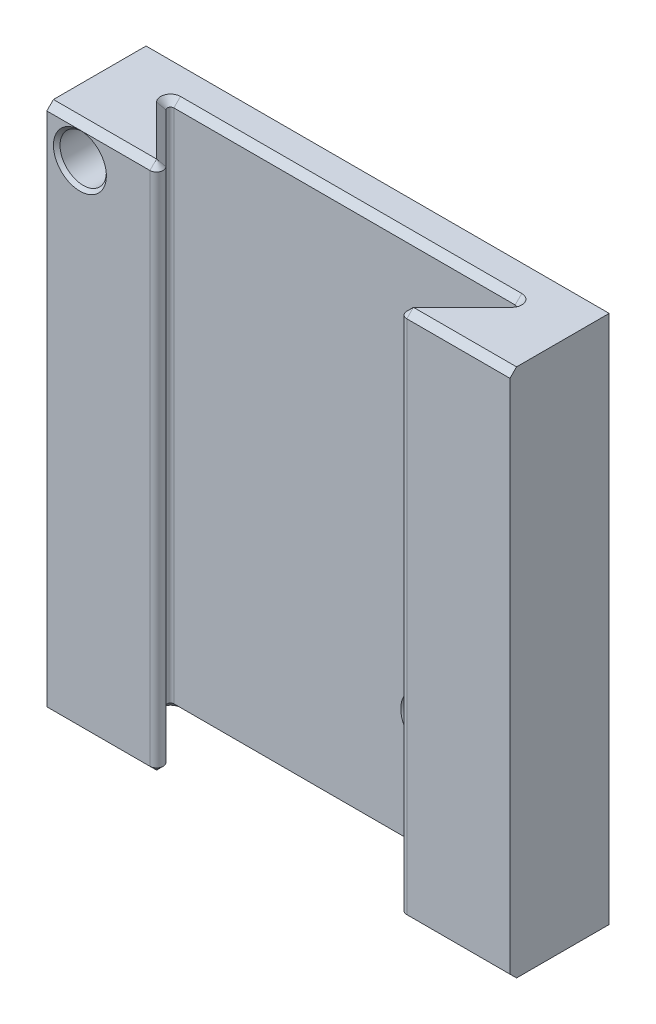
ISO-10303-21;
HEADER;
FILE_DESCRIPTION(('STEP AP214'),'2;1');
FILE_NAME('part.step','',(''),(''),'','','');
FILE_SCHEMA(('AUTOMOTIVE_DESIGN { 1 0 10303 214 1 1 1 1 }'));
ENDSEC;
DATA;
#1=APPLICATION_CONTEXT('core data for automotive mechanical design processes');
#2=APPLICATION_PROTOCOL_DEFINITION('international standard','automotive_design',2000,#1);
#3=PRODUCT_CONTEXT('',#1,'mechanical');
#4=PRODUCT('Part','Part','',(#3));
#5=PRODUCT_RELATED_PRODUCT_CATEGORY('part','',(#4));
#6=PRODUCT_DEFINITION_FORMATION('','',#4);
#7=PRODUCT_DEFINITION_CONTEXT('part definition',#1,'design');
#8=PRODUCT_DEFINITION('design','',#6,#7);
#9=PRODUCT_DEFINITION_SHAPE('','',#8);
#10=(LENGTH_UNIT() NAMED_UNIT(*) SI_UNIT(.MILLI.,.METRE.));
#11=(NAMED_UNIT(*) PLANE_ANGLE_UNIT() SI_UNIT($,.RADIAN.));
#12=(NAMED_UNIT(*) SI_UNIT($,.STERADIAN.) SOLID_ANGLE_UNIT());
#13=UNCERTAINTY_MEASURE_WITH_UNIT(LENGTH_MEASURE(1.E-05),#10,'distance_accuracy_value','');
#14=(GEOMETRIC_REPRESENTATION_CONTEXT(3) GLOBAL_UNCERTAINTY_ASSIGNED_CONTEXT((#13)) GLOBAL_UNIT_ASSIGNED_CONTEXT((#10,
#11,#12)) REPRESENTATION_CONTEXT('',''));
#15=CARTESIAN_POINT('',(0.,0.,0.));
#16=DIRECTION('',(0.,0.,1.));
#17=DIRECTION('',(1.,0.,0.));
#18=AXIS2_PLACEMENT_3D('',#15,#16,#17);
#19=CARTESIAN_POINT('',(0.,0.,15.));
#20=DIRECTION('',(0.,0.,-1.));
#21=DIRECTION('',(-1.,0.,0.));
#22=AXIS2_PLACEMENT_3D('',#19,#20,#21);
#23=PLANE('',#22);
#24=DIRECTION('',(-1.,0.,0.));
#25=VECTOR('',#24,1.);
#26=CARTESIAN_POINT('',(0.,79.,15.));
#27=LINE('',#26,#25);
#28=CARTESIAN_POINT('',(15.585786437627,79.,15.));
#29=VERTEX_POINT('',#28);
#30=CARTESIAN_POINT('',(5.,79.,15.));
#31=VERTEX_POINT('',#30);
#32=EDGE_CURVE('E244',#29,#31,#27,.T.);
#33=ORIENTED_EDGE('',*,*,#32,.T.);
#34=CARTESIAN_POINT('',(5.,75.,15.));
#35=DIRECTION('',(0.,0.,-1.));
#36=DIRECTION('',(-1.,0.,0.));
#37=AXIS2_PLACEMENT_3D('',#34,#35,#36);
#38=CIRCLE('',#37,4.);
#39=EDGE_CURVE('E48',#31,#31,#38,.T.);
#40=ORIENTED_EDGE('',*,*,#39,.T.);
#41=CARTESIAN_POINT('',(0.,79.,15.));
#42=VERTEX_POINT('',#41);
#43=EDGE_CURVE('E243',#31,#42,#27,.T.);
#44=ORIENTED_EDGE('',*,*,#43,.T.);
#45=DIRECTION('',(0.,-1.,0.));
#46=VECTOR('',#45,1.);
#47=CARTESIAN_POINT('',(0.,0.,15.));
#48=LINE('',#47,#46);
#49=CARTESIAN_POINT('',(0.,1.,15.));
#50=VERTEX_POINT('',#49);
#51=EDGE_CURVE('E212',#42,#50,#48,.T.);
#52=ORIENTED_EDGE('',*,*,#51,.T.);
#53=DIRECTION('',(1.,0.,0.));
#54=VECTOR('',#53,1.);
#55=CARTESIAN_POINT('',(0.,1.,15.));
#56=LINE('',#55,#54);
#57=CARTESIAN_POINT('',(15.585786437627,1.,15.));
#58=VERTEX_POINT('',#57);
#59=EDGE_CURVE('E240',#50,#58,#56,.T.);
#60=ORIENTED_EDGE('',*,*,#59,.T.);
#61=DIRECTION('',(0.,-1.,0.));
#62=VECTOR('',#61,1.);
#63=CARTESIAN_POINT('',(15.585786437627,0.,15.));
#64=LINE('',#63,#62);
#65=EDGE_CURVE('E237',#58,#29,#64,.F.);
#66=ORIENTED_EDGE('',*,*,#65,.T.);
#67=EDGE_LOOP('',(#33,#40,#44,#52,#60,#66));
#68=FACE_BOUND('',#67,.T.);
#69=ADVANCED_FACE('F35',(#68),#23,.F.);
#70=CARTESIAN_POINT('',(0.,0.,15.));
#71=DIRECTION('',(1.,0.,0.));
#72=DIRECTION('',(0.,0.,-1.));
#73=AXIS2_PLACEMENT_3D('',#70,#71,#72);
#74=PLANE('',#73);
#75=ORIENTED_EDGE('',*,*,#51,.F.);
#76=DIRECTION('',(0.,-0.707106781186548,0.707106781186548));
#77=VECTOR('',#76,1.);
#78=CARTESIAN_POINT('',(0.,79.,15.));
#79=LINE('',#78,#77);
#80=CARTESIAN_POINT('',(0.,80.,14.));
#81=VERTEX_POINT('',#80);
#82=EDGE_CURVE('E249',#42,#81,#79,.F.);
#83=ORIENTED_EDGE('',*,*,#82,.T.);
#84=DIRECTION('',(0.,0.,-1.));
#85=VECTOR('',#84,1.);
#86=CARTESIAN_POINT('',(0.,80.,15.));
#87=LINE('',#86,#85);
#88=CARTESIAN_POINT('',(0.,80.,0.));
#89=VERTEX_POINT('',#88);
#90=EDGE_CURVE('E198',#81,#89,#87,.T.);
#91=ORIENTED_EDGE('',*,*,#90,.T.);
#92=DIRECTION('',(0.,-1.,0.));
#93=VECTOR('',#92,1.);
#94=CARTESIAN_POINT('',(0.,0.,0.));
#95=LINE('',#94,#93);
#96=CARTESIAN_POINT('',(0.,0.,0.));
#97=VERTEX_POINT('',#96);
#98=EDGE_CURVE('E191',#89,#97,#95,.T.);
#99=ORIENTED_EDGE('',*,*,#98,.T.);
#100=DIRECTION('',(0.,0.,-1.));
#101=VECTOR('',#100,1.);
#102=CARTESIAN_POINT('',(0.,0.,15.));
#103=LINE('',#102,#101);
#104=CARTESIAN_POINT('',(0.,0.,14.));
#105=VERTEX_POINT('',#104);
#106=EDGE_CURVE('E173',#105,#97,#103,.T.);
#107=ORIENTED_EDGE('',*,*,#106,.F.);
#108=DIRECTION('',(0.,-0.707106781186548,-0.707106781186548));
#109=VECTOR('',#108,1.);
#110=CARTESIAN_POINT('',(0.,1.,15.));
#111=LINE('',#110,#109);
#112=EDGE_CURVE('E247',#105,#50,#111,.F.);
#113=ORIENTED_EDGE('',*,*,#112,.T.);
#114=EDGE_LOOP('',(#75,#83,#91,#99,#107,#113));
#115=FACE_BOUND('',#114,.T.);
#116=ADVANCED_FACE('F196',(#115),#74,.F.);
#117=CARTESIAN_POINT('',(0.,0.,15.));
#118=DIRECTION('',(0.,1.,0.));
#119=DIRECTION('',(0.,0.,1.));
#120=AXIS2_PLACEMENT_3D('',#117,#118,#119);
#121=PLANE('',#120);
#122=DIRECTION('',(0.707106781186551,0.,0.707106781186544));
#123=VECTOR('',#122,1.);
#124=CARTESIAN_POINT('',(8.29289321881341,0.,6.7071067811865));
#125=LINE('',#124,#123);
#126=CARTESIAN_POINT('',(8.14644660940674,0.,6.56066017177983));
#127=VERTEX_POINT('',#126);
#128=CARTESIAN_POINT('',(15.585786437627,0.,14.));
#129=VERTEX_POINT('',#128);
#130=EDGE_CURVE('E55',#127,#129,#125,.T.);
#131=ORIENTED_EDGE('',*,*,#130,.T.);
#132=DIRECTION('',(-1.,0.,0.));
#133=VECTOR('',#132,1.);
#134=CARTESIAN_POINT('',(0.,0.,14.));
#135=LINE('',#134,#133);
#136=EDGE_CURVE('E180',#129,#105,#135,.T.);
#137=ORIENTED_EDGE('',*,*,#136,.T.);
#138=ORIENTED_EDGE('',*,*,#106,.T.);
#139=DIRECTION('',(1.,0.,0.));
#140=VECTOR('',#139,1.);
#141=CARTESIAN_POINT('',(0.,0.,0.));
#142=LINE('',#141,#140);
#143=CARTESIAN_POINT('',(70.,0.,0.));
#144=VERTEX_POINT('',#143);
#145=EDGE_CURVE('E177',#97,#144,#142,.T.);
#146=ORIENTED_EDGE('',*,*,#145,.T.);
#147=DIRECTION('',(0.,0.,-1.));
#148=VECTOR('',#147,1.);
#149=CARTESIAN_POINT('',(70.,0.,15.));
#150=LINE('',#149,#148);
#151=CARTESIAN_POINT('',(70.,0.,14.));
#152=VERTEX_POINT('',#151);
#153=EDGE_CURVE('E185',#152,#144,#150,.T.);
#154=ORIENTED_EDGE('',*,*,#153,.F.);
#155=DIRECTION('',(-1.,0.,0.));
#156=VECTOR('',#155,1.);
#157=CARTESIAN_POINT('',(0.,0.,14.));
#158=LINE('',#157,#156);
#159=CARTESIAN_POINT('',(54.414213562373,0.,14.));
#160=VERTEX_POINT('',#159);
#161=EDGE_CURVE('E310',#152,#160,#158,.T.);
#162=ORIENTED_EDGE('',*,*,#161,.T.);
#163=DIRECTION('',(0.707106781186551,0.,-0.707106781186544));
#164=VECTOR('',#163,1.);
#165=CARTESIAN_POINT('',(26.7071067811862,0.,41.7071067811865));
#166=LINE('',#165,#164);
#167=CARTESIAN_POINT('',(61.8535533905933,0.,6.56066017177983));
#168=VERTEX_POINT('',#167);
#169=EDGE_CURVE('E307',#160,#168,#166,.T.);
#170=ORIENTED_EDGE('',*,*,#169,.T.);
#171=CARTESIAN_POINT('',(60.7928932188134,0.,5.5));
#172=DIRECTION('',(0.,1.,0.));
#173=DIRECTION('',(0.,0.,1.));
#174=AXIS2_PLACEMENT_3D('',#171,#172,#173);
#175=CIRCLE('',#174,1.5);
#176=CARTESIAN_POINT('',(60.7928932188134,0.,4.));
#177=VERTEX_POINT('',#176);
#178=EDGE_CURVE('E303',#168,#177,#175,.T.);
#179=ORIENTED_EDGE('',*,*,#178,.T.);
#180=DIRECTION('',(-1.,0.,0.));
#181=VECTOR('',#180,1.);
#182=CARTESIAN_POINT('',(0.,0.,4.));
#183=LINE('',#182,#181);
#184=CARTESIAN_POINT('',(9.20710678118656,0.,4.));
#185=VERTEX_POINT('',#184);
#186=EDGE_CURVE('E301',#177,#185,#183,.T.);
#187=ORIENTED_EDGE('',*,*,#186,.T.);
#188=CARTESIAN_POINT('',(9.20710678118656,0.,5.5));
#189=DIRECTION('',(0.,1.,0.));
#190=DIRECTION('',(0.,0.,1.));
#191=AXIS2_PLACEMENT_3D('',#188,#189,#190);
#192=CIRCLE('',#191,1.5);
#193=EDGE_CURVE('E305',#185,#127,#192,.T.);
#194=ORIENTED_EDGE('',*,*,#193,.T.);
#195=EDGE_LOOP('',(#131,#137,#138,#146,#154,#162,#170,#179,#187,#194));
#196=FACE_BOUND('',#195,.T.);
#197=ADVANCED_FACE('F175',(#196),#121,.F.);
#198=CARTESIAN_POINT('',(70.,0.,15.));
#199=DIRECTION('',(-1.,0.,0.));
#200=DIRECTION('',(0.,0.,1.));
#201=AXIS2_PLACEMENT_3D('',#198,#199,#200);
#202=PLANE('',#201);
#203=DIRECTION('',(0.,0.,-1.));
#204=VECTOR('',#203,1.);
#205=CARTESIAN_POINT('',(70.,80.,15.));
#206=LINE('',#205,#204);
#207=CARTESIAN_POINT('',(70.,80.,14.));
#208=VERTEX_POINT('',#207);
#209=CARTESIAN_POINT('',(70.,80.,0.));
#210=VERTEX_POINT('',#209);
#211=EDGE_CURVE('E214',#208,#210,#206,.T.);
#212=ORIENTED_EDGE('',*,*,#211,.F.);
#213=DIRECTION('',(0.,0.707106781186548,-0.707106781186548));
#214=VECTOR('',#213,1.);
#215=CARTESIAN_POINT('',(70.,79.,15.));
#216=LINE('',#215,#214);
#217=CARTESIAN_POINT('',(70.,79.,15.));
#218=VERTEX_POINT('',#217);
#219=EDGE_CURVE('E271',#208,#218,#216,.F.);
#220=ORIENTED_EDGE('',*,*,#219,.T.);
#221=DIRECTION('',(0.,1.,0.));
#222=VECTOR('',#221,1.);
#223=CARTESIAN_POINT('',(70.,0.,15.));
#224=LINE('',#223,#222);
#225=CARTESIAN_POINT('',(70.,1.,15.));
#226=VERTEX_POINT('',#225);
#227=EDGE_CURVE('E206',#226,#218,#224,.T.);
#228=ORIENTED_EDGE('',*,*,#227,.F.);
#229=DIRECTION('',(0.,0.707106781186548,0.707106781186548));
#230=VECTOR('',#229,1.);
#231=CARTESIAN_POINT('',(70.,1.,15.));
#232=LINE('',#231,#230);
#233=EDGE_CURVE('E269',#226,#152,#232,.F.);
#234=ORIENTED_EDGE('',*,*,#233,.T.);
#235=ORIENTED_EDGE('',*,*,#153,.T.);
#236=DIRECTION('',(0.,1.,0.));
#237=VECTOR('',#236,1.);
#238=CARTESIAN_POINT('',(70.,0.,0.));
#239=LINE('',#238,#237);
#240=EDGE_CURVE('E193',#144,#210,#239,.T.);
#241=ORIENTED_EDGE('',*,*,#240,.T.);
#242=EDGE_LOOP('',(#212,#220,#228,#234,#235,#241));
#243=FACE_BOUND('',#242,.T.);
#244=ADVANCED_FACE('F701',(#243),#202,.F.);
#245=CARTESIAN_POINT('',(0.,80.,15.));
#246=DIRECTION('',(0.,-1.,0.));
#247=DIRECTION('',(0.,0.,-1.));
#248=AXIS2_PLACEMENT_3D('',#245,#246,#247);
#249=PLANE('',#248);
#250=ORIENTED_EDGE('',*,*,#90,.F.);
#251=DIRECTION('',(1.,0.,0.));
#252=VECTOR('',#251,1.);
#253=CARTESIAN_POINT('',(0.,80.,14.));
#254=LINE('',#253,#252);
#255=CARTESIAN_POINT('',(15.585786437627,80.,14.));
#256=VERTEX_POINT('',#255);
#257=EDGE_CURVE('E263',#81,#256,#254,.T.);
#258=ORIENTED_EDGE('',*,*,#257,.T.);
#259=DIRECTION('',(-0.707106781186551,0.,-0.707106781186544));
#260=VECTOR('',#259,1.);
#261=CARTESIAN_POINT('',(8.29289321881341,80.,6.7071067811865));
#262=LINE('',#261,#260);
#263=CARTESIAN_POINT('',(8.14644660940674,80.,6.56066017177983));
#264=VERTEX_POINT('',#263);
#265=EDGE_CURVE('E259',#256,#264,#262,.T.);
#266=ORIENTED_EDGE('',*,*,#265,.T.);
#267=CARTESIAN_POINT('',(9.20710678118656,80.,5.5));
#268=DIRECTION('',(0.,-1.,0.));
#269=DIRECTION('',(0.,0.,-1.));
#270=AXIS2_PLACEMENT_3D('',#267,#268,#269);
#271=CIRCLE('',#270,1.5);
#272=CARTESIAN_POINT('',(9.20710678118656,80.,4.));
#273=VERTEX_POINT('',#272);
#274=EDGE_CURVE('E255',#264,#273,#271,.T.);
#275=ORIENTED_EDGE('',*,*,#274,.T.);
#276=DIRECTION('',(1.,0.,0.));
#277=VECTOR('',#276,1.);
#278=CARTESIAN_POINT('',(0.,80.,4.));
#279=LINE('',#278,#277);
#280=CARTESIAN_POINT('',(60.7928932188134,80.,4.));
#281=VERTEX_POINT('',#280);
#282=EDGE_CURVE('E251',#273,#281,#279,.T.);
#283=ORIENTED_EDGE('',*,*,#282,.T.);
#284=CARTESIAN_POINT('',(60.7928932188134,80.,5.5));
#285=DIRECTION('',(0.,-1.,0.));
#286=DIRECTION('',(0.,0.,-1.));
#287=AXIS2_PLACEMENT_3D('',#284,#285,#286);
#288=CIRCLE('',#287,1.5);
#289=CARTESIAN_POINT('',(61.8535533905933,80.,6.56066017177983));
#290=VERTEX_POINT('',#289);
#291=EDGE_CURVE('E253',#281,#290,#288,.T.);
#292=ORIENTED_EDGE('',*,*,#291,.T.);
#293=DIRECTION('',(-0.707106781186551,0.,0.707106781186544));
#294=VECTOR('',#293,1.);
#295=CARTESIAN_POINT('',(26.7071067811862,80.,41.7071067811865));
#296=LINE('',#295,#294);
#297=CARTESIAN_POINT('',(54.414213562373,80.,14.));
#298=VERTEX_POINT('',#297);
#299=EDGE_CURVE('E257',#290,#298,#296,.T.);
#300=ORIENTED_EDGE('',*,*,#299,.T.);
#301=DIRECTION('',(1.,0.,0.));
#302=VECTOR('',#301,1.);
#303=CARTESIAN_POINT('',(0.,80.,14.));
#304=LINE('',#303,#302);
#305=EDGE_CURVE('E261',#298,#208,#304,.T.);
#306=ORIENTED_EDGE('',*,*,#305,.T.);
#307=ORIENTED_EDGE('',*,*,#211,.T.);
#308=DIRECTION('',(-1.,0.,0.));
#309=VECTOR('',#308,1.);
#310=CARTESIAN_POINT('',(0.,80.,0.));
#311=LINE('',#310,#309);
#312=EDGE_CURVE('E210',#210,#89,#311,.T.);
#313=ORIENTED_EDGE('',*,*,#312,.T.);
#314=EDGE_LOOP('',(#250,#258,#266,#275,#283,#292,#300,#306,#307,#313));
#315=FACE_BOUND('',#314,.T.);
#316=ADVANCED_FACE('F396',(#315),#249,.F.);
#317=ORIENTED_EDGE('',*,*,#227,.T.);
#318=DIRECTION('',(-1.,0.,0.));
#319=VECTOR('',#318,1.);
#320=CARTESIAN_POINT('',(0.,79.,15.));
#321=LINE('',#320,#319);
#322=CARTESIAN_POINT('',(54.414213562373,79.,15.));
#323=VERTEX_POINT('',#322);
#324=EDGE_CURVE('E267',#218,#323,#321,.T.);
#325=ORIENTED_EDGE('',*,*,#324,.T.);
#326=DIRECTION('',(0.,-1.,0.));
#327=VECTOR('',#326,1.);
#328=CARTESIAN_POINT('',(54.414213562373,0.,15.));
#329=LINE('',#328,#327);
#330=CARTESIAN_POINT('',(54.414213562373,1.,15.));
#331=VERTEX_POINT('',#330);
#332=EDGE_CURVE('E228',#323,#331,#329,.T.);
#333=ORIENTED_EDGE('',*,*,#332,.T.);
#334=DIRECTION('',(1.,0.,0.));
#335=VECTOR('',#334,1.);
#336=CARTESIAN_POINT('',(0.,1.,15.));
#337=LINE('',#336,#335);
#338=EDGE_CURVE('E265',#331,#226,#337,.T.);
#339=ORIENTED_EDGE('',*,*,#338,.T.);
#340=EDGE_LOOP('',(#317,#325,#333,#339));
#341=FACE_BOUND('',#340,.T.);
#342=ADVANCED_FACE('F385',(#341),#23,.F.);
#343=CARTESIAN_POINT('',(0.,0.,0.));
#344=DIRECTION('',(0.,0.,-1.));
#345=DIRECTION('',(-1.,0.,0.));
#346=AXIS2_PLACEMENT_3D('',#343,#344,#345);
#347=PLANE('',#346);
#348=CARTESIAN_POINT('',(5.,75.,0.));
#349=DIRECTION('',(0.,0.,-1.));
#350=DIRECTION('',(-1.,0.,0.));
#351=AXIS2_PLACEMENT_3D('',#348,#349,#350);
#352=CIRCLE('',#351,4.00000000000002);
#353=CARTESIAN_POINT('',(0.999999999999982,75.,0.));
#354=VERTEX_POINT('',#353);
#355=EDGE_CURVE('E366',#354,#354,#352,.F.);
#356=ORIENTED_EDGE('',*,*,#355,.T.);
#357=EDGE_LOOP('',(#356));
#358=FACE_BOUND('',#357,.T.);
#359=CARTESIAN_POINT('',(47.5,17.5,0.));
#360=DIRECTION('',(0.,0.,-1.));
#361=DIRECTION('',(-1.,0.,0.));
#362=AXIS2_PLACEMENT_3D('',#359,#360,#361);
#363=CIRCLE('',#362,4.);
#364=CARTESIAN_POINT('',(43.5,17.5,0.));
#365=VERTEX_POINT('',#364);
#366=EDGE_CURVE('E363',#365,#365,#363,.F.);
#367=ORIENTED_EDGE('',*,*,#366,.T.);
#368=EDGE_LOOP('',(#367));
#369=FACE_BOUND('',#368,.T.);
#370=ORIENTED_EDGE('',*,*,#98,.F.);
#371=ORIENTED_EDGE('',*,*,#312,.F.);
#372=ORIENTED_EDGE('',*,*,#240,.F.);
#373=ORIENTED_EDGE('',*,*,#145,.F.);
#374=EDGE_LOOP('',(#370,#371,#372,#373));
#375=FACE_BOUND('',#374,.T.);
#376=ADVANCED_FACE('F189',(#358,#369,#375),#347,.T.);
#377=CARTESIAN_POINT('',(8.,80.,5.));
#378=DIRECTION('',(0.,0.,-1.));
#379=DIRECTION('',(-1.,0.,0.));
#380=AXIS2_PLACEMENT_3D('',#377,#378,#379);
#381=PLANE('',#380);
#382=CARTESIAN_POINT('',(47.5,17.5,5.));
#383=DIRECTION('',(0.,0.,-1.));
#384=DIRECTION('',(-1.,0.,0.));
#385=AXIS2_PLACEMENT_3D('',#382,#383,#384);
#386=CIRCLE('',#385,3.99999999999999);
#387=CARTESIAN_POINT('',(43.5,17.5,5.));
#388=VERTEX_POINT('',#387);
#389=EDGE_CURVE('E11',#388,#388,#386,.T.);
#390=ORIENTED_EDGE('',*,*,#389,.T.);
#391=EDGE_LOOP('',(#390));
#392=FACE_BOUND('',#391,.T.);
#393=DIRECTION('',(0.,-1.,0.));
#394=VECTOR('',#393,1.);
#395=CARTESIAN_POINT('',(60.7928932188134,80.,5.));
#396=LINE('',#395,#394);
#397=CARTESIAN_POINT('',(60.7928932188134,1.,5.));
#398=VERTEX_POINT('',#397);
#399=CARTESIAN_POINT('',(60.7928932188134,79.,5.));
#400=VERTEX_POINT('',#399);
#401=EDGE_CURVE('E222',#398,#400,#396,.F.);
#402=ORIENTED_EDGE('',*,*,#401,.T.);
#403=DIRECTION('',(-1.,0.,0.));
#404=VECTOR('',#403,1.);
#405=CARTESIAN_POINT('',(8.,79.,5.));
#406=LINE('',#405,#404);
#407=CARTESIAN_POINT('',(9.20710678118656,79.,5.));
#408=VERTEX_POINT('',#407);
#409=EDGE_CURVE('E299',#400,#408,#406,.T.);
#410=ORIENTED_EDGE('',*,*,#409,.T.);
#411=DIRECTION('',(0.,-1.,0.));
#412=VECTOR('',#411,1.);
#413=CARTESIAN_POINT('',(9.20710678118656,0.,5.));
#414=LINE('',#413,#412);
#415=CARTESIAN_POINT('',(9.20710678118656,1.,5.));
#416=VERTEX_POINT('',#415);
#417=EDGE_CURVE('E219',#408,#416,#414,.T.);
#418=ORIENTED_EDGE('',*,*,#417,.T.);
#419=DIRECTION('',(1.,0.,0.));
#420=VECTOR('',#419,1.);
#421=CARTESIAN_POINT('',(8.,1.,5.));
#422=LINE('',#421,#420);
#423=EDGE_CURVE('E297',#416,#398,#422,.T.);
#424=ORIENTED_EDGE('',*,*,#423,.T.);
#425=EDGE_LOOP('',(#402,#410,#418,#424));
#426=FACE_BOUND('',#425,.T.);
#427=ADVANCED_FACE('F384',(#392,#426),#381,.F.);
#428=CARTESIAN_POINT('',(18.0000000000001,80.,15.));
#429=DIRECTION('',(-0.707106781186544,0.,0.707106781186551));
#430=DIRECTION('',(0.707106781186551,0.,0.707106781186544));
#431=AXIS2_PLACEMENT_3D('',#428,#429,#430);
#432=PLANE('',#431);
#433=DIRECTION('',(0.,-1.,0.));
#434=VECTOR('',#433,1.);
#435=CARTESIAN_POINT('',(8.85355339059329,73.197224362268,5.85355339059328));
#436=LINE('',#435,#434);
#437=CARTESIAN_POINT('',(8.85355339059329,1.,5.85355339059328));
#438=VERTEX_POINT('',#437);
#439=CARTESIAN_POINT('',(8.85355339059329,79.,5.85355339059328));
#440=VERTEX_POINT('',#439);
#441=EDGE_CURVE('E225',#438,#440,#436,.F.);
#442=ORIENTED_EDGE('',*,*,#441,.T.);
#443=DIRECTION('',(0.707106781186551,0.,0.707106781186544));
#444=VECTOR('',#443,1.);
#445=CARTESIAN_POINT('',(18.0000000000001,79.,15.));
#446=LINE('',#445,#444);
#447=CARTESIAN_POINT('',(16.2928932188135,79.,13.2928932188134));
#448=VERTEX_POINT('',#447);
#449=EDGE_CURVE('E283',#440,#448,#446,.T.);
#450=ORIENTED_EDGE('',*,*,#449,.T.);
#451=DIRECTION('',(0.,-1.,0.));
#452=VECTOR('',#451,1.);
#453=CARTESIAN_POINT('',(16.2928932188135,80.,13.2928932188134));
#454=LINE('',#453,#452);
#455=CARTESIAN_POINT('',(16.2928932188135,1.,13.2928932188134));
#456=VERTEX_POINT('',#455);
#457=EDGE_CURVE('E234',#448,#456,#454,.T.);
#458=ORIENTED_EDGE('',*,*,#457,.T.);
#459=DIRECTION('',(-0.707106781186551,0.,-0.707106781186544));
#460=VECTOR('',#459,1.);
#461=CARTESIAN_POINT('',(18.0000000000001,1.,15.));
#462=LINE('',#461,#460);
#463=EDGE_CURVE('E281',#456,#438,#462,.T.);
#464=ORIENTED_EDGE('',*,*,#463,.T.);
#465=EDGE_LOOP('',(#442,#450,#458,#464));
#466=FACE_BOUND('',#465,.T.);
#467=ADVANCED_FACE('F392',(#466),#432,.F.);
#468=CARTESIAN_POINT('',(62.,80.,5.));
#469=DIRECTION('',(0.707106781186544,0.,0.707106781186552));
#470=DIRECTION('',(0.707106781186551,0.,-0.707106781186544));
#471=AXIS2_PLACEMENT_3D('',#468,#469,#470);
#472=PLANE('',#471);
#473=DIRECTION('',(0.,-1.,0.));
#474=VECTOR('',#473,1.);
#475=CARTESIAN_POINT('',(53.7071067811865,80.,13.2928932188134));
#476=LINE('',#475,#474);
#477=CARTESIAN_POINT('',(53.7071067811865,1.,13.2928932188134));
#478=VERTEX_POINT('',#477);
#479=CARTESIAN_POINT('',(53.7071067811865,79.,13.2928932188134));
#480=VERTEX_POINT('',#479);
#481=EDGE_CURVE('E231',#478,#480,#476,.F.);
#482=ORIENTED_EDGE('',*,*,#481,.T.);
#483=DIRECTION('',(0.707106781186551,0.,-0.707106781186544));
#484=VECTOR('',#483,1.);
#485=CARTESIAN_POINT('',(62.,79.,5.));
#486=LINE('',#485,#484);
#487=CARTESIAN_POINT('',(61.1464466094067,79.,5.85355339059328));
#488=VERTEX_POINT('',#487);
#489=EDGE_CURVE('E287',#480,#488,#486,.T.);
#490=ORIENTED_EDGE('',*,*,#489,.T.);
#491=DIRECTION('',(0.,-1.,0.));
#492=VECTOR('',#491,1.);
#493=CARTESIAN_POINT('',(61.1464466094067,0.,5.85355339059328));
#494=LINE('',#493,#492);
#495=CARTESIAN_POINT('',(61.1464466094067,1.,5.85355339059328));
#496=VERTEX_POINT('',#495);
#497=EDGE_CURVE('E184',#488,#496,#494,.T.);
#498=ORIENTED_EDGE('',*,*,#497,.T.);
#499=DIRECTION('',(-0.707106781186551,0.,0.707106781186544));
#500=VECTOR('',#499,1.);
#501=CARTESIAN_POINT('',(62.,1.,5.));
#502=LINE('',#501,#500);
#503=EDGE_CURVE('E285',#496,#478,#502,.T.);
#504=ORIENTED_EDGE('',*,*,#503,.T.);
#505=EDGE_LOOP('',(#482,#490,#498,#504));
#506=FACE_BOUND('',#505,.T.);
#507=ADVANCED_FACE('F407',(#506),#472,.F.);
#508=CARTESIAN_POINT('',(5.,75.,0.));
#509=DIRECTION('',(0.,0.,1.));
#510=DIRECTION('',(1.,0.,0.));
#511=AXIS2_PLACEMENT_3D('',#508,#509,#510);
#512=CYLINDRICAL_SURFACE('',#511,3.5);
#513=CARTESIAN_POINT('',(5.,75.,14.5));
#514=DIRECTION('',(0.,0.,-1.));
#515=DIRECTION('',(-1.,0.,0.));
#516=AXIS2_PLACEMENT_3D('',#513,#514,#515);
#517=CIRCLE('',#516,3.5);
#518=CARTESIAN_POINT('',(1.5,75.,14.5));
#519=VERTEX_POINT('',#518);
#520=EDGE_CURVE('E359',#519,#519,#517,.F.);
#521=ORIENTED_EDGE('',*,*,#520,.T.);
#522=EDGE_LOOP('',(#521));
#523=FACE_BOUND('',#522,.T.);
#524=CARTESIAN_POINT('',(5.,75.,0.500000000000016));
#525=DIRECTION('',(0.,0.,-1.));
#526=DIRECTION('',(-1.,0.,0.));
#527=AXIS2_PLACEMENT_3D('',#524,#525,#526);
#528=CIRCLE('',#527,3.5);
#529=CARTESIAN_POINT('',(1.5,75.,0.500000000000016));
#530=VERTEX_POINT('',#529);
#531=EDGE_CURVE('E313',#530,#530,#528,.T.);
#532=ORIENTED_EDGE('',*,*,#531,.T.);
#533=EDGE_LOOP('',(#532));
#534=FACE_BOUND('',#533,.T.);
#535=ADVANCED_FACE('F410',(#523,#534),#512,.F.);
#536=CARTESIAN_POINT('',(47.5,17.5,0.));
#537=DIRECTION('',(0.,0.,1.));
#538=DIRECTION('',(1.,0.,0.));
#539=AXIS2_PLACEMENT_3D('',#536,#537,#538);
#540=CYLINDRICAL_SURFACE('',#539,3.5);
#541=CARTESIAN_POINT('',(47.5,17.5,0.5));
#542=DIRECTION('',(0.,0.,-1.));
#543=DIRECTION('',(-1.,0.,0.));
#544=AXIS2_PLACEMENT_3D('',#541,#542,#543);
#545=CIRCLE('',#544,3.5);
#546=CARTESIAN_POINT('',(44.,17.5,0.5));
#547=VERTEX_POINT('',#546);
#548=EDGE_CURVE('E43',#547,#547,#545,.T.);
#549=ORIENTED_EDGE('',*,*,#548,.T.);
#550=EDGE_LOOP('',(#549));
#551=FACE_BOUND('',#550,.T.);
#552=CARTESIAN_POINT('',(47.5,17.5,4.50000000000001));
#553=DIRECTION('',(0.,0.,-1.));
#554=DIRECTION('',(-1.,0.,0.));
#555=AXIS2_PLACEMENT_3D('',#552,#553,#554);
#556=CIRCLE('',#555,3.5);
#557=CARTESIAN_POINT('',(44.,17.5,4.50000000000001));
#558=VERTEX_POINT('',#557);
#559=EDGE_CURVE('E369',#558,#558,#556,.F.);
#560=ORIENTED_EDGE('',*,*,#559,.T.);
#561=EDGE_LOOP('',(#560));
#562=FACE_BOUND('',#561,.T.);
#563=ADVANCED_FACE('F374',(#551,#562),#540,.F.);
#564=CARTESIAN_POINT('',(60.7928932188134,80.,5.5));
#565=DIRECTION('',(0.,1.,0.));
#566=DIRECTION('',(0.,0.,1.));
#567=AXIS2_PLACEMENT_3D('',#564,#565,#566);
#568=CYLINDRICAL_SURFACE('',#567,0.5);
#569=ORIENTED_EDGE('',*,*,#497,.F.);
#570=CARTESIAN_POINT('',(60.7928932188134,79.,5.5));
#571=DIRECTION('',(0.,-1.,0.));
#572=DIRECTION('',(0.,0.,-1.));
#573=AXIS2_PLACEMENT_3D('',#570,#571,#572);
#574=CIRCLE('',#573,0.5);
#575=EDGE_CURVE('E295',#488,#400,#574,.F.);
#576=ORIENTED_EDGE('',*,*,#575,.T.);
#577=ORIENTED_EDGE('',*,*,#401,.F.);
#578=CARTESIAN_POINT('',(60.7928932188134,1.,5.5));
#579=DIRECTION('',(0.,1.,0.));
#580=DIRECTION('',(0.,0.,1.));
#581=AXIS2_PLACEMENT_3D('',#578,#579,#580);
#582=CIRCLE('',#581,0.5);
#583=EDGE_CURVE('E293',#398,#496,#582,.F.);
#584=ORIENTED_EDGE('',*,*,#583,.T.);
#585=EDGE_LOOP('',(#569,#576,#577,#584));
#586=FACE_BOUND('',#585,.T.);
#587=ADVANCED_FACE('F419',(#586),#568,.F.);
#588=CARTESIAN_POINT('',(9.20710678118656,80.,5.5));
#589=DIRECTION('',(0.,1.,0.));
#590=DIRECTION('',(0.,0.,1.));
#591=AXIS2_PLACEMENT_3D('',#588,#589,#590);
#592=CYLINDRICAL_SURFACE('',#591,0.5);
#593=ORIENTED_EDGE('',*,*,#417,.F.);
#594=CARTESIAN_POINT('',(9.20710678118656,79.,5.5));
#595=DIRECTION('',(0.,-1.,0.));
#596=DIRECTION('',(0.,0.,-1.));
#597=AXIS2_PLACEMENT_3D('',#594,#595,#596);
#598=CIRCLE('',#597,0.5);
#599=EDGE_CURVE('E291',#408,#440,#598,.F.);
#600=ORIENTED_EDGE('',*,*,#599,.T.);
#601=ORIENTED_EDGE('',*,*,#441,.F.);
#602=CARTESIAN_POINT('',(9.20710678118656,1.,5.5));
#603=DIRECTION('',(0.,1.,0.));
#604=DIRECTION('',(0.,0.,1.));
#605=AXIS2_PLACEMENT_3D('',#602,#603,#604);
#606=CIRCLE('',#605,0.5);
#607=EDGE_CURVE('E289',#438,#416,#606,.F.);
#608=ORIENTED_EDGE('',*,*,#607,.T.);
#609=EDGE_LOOP('',(#593,#600,#601,#608));
#610=FACE_BOUND('',#609,.T.);
#611=ADVANCED_FACE('F424',(#610),#592,.F.);
#612=CARTESIAN_POINT('',(54.414213562373,0.,14.));
#613=DIRECTION('',(0.,-1.,0.));
#614=DIRECTION('',(0.,0.,-1.));
#615=AXIS2_PLACEMENT_3D('',#612,#613,#614);
#616=CYLINDRICAL_SURFACE('',#615,1.);
#617=ORIENTED_EDGE('',*,*,#332,.F.);
#618=CARTESIAN_POINT('',(54.414213562373,79.,14.));
#619=DIRECTION('',(0.,-1.,0.));
#620=DIRECTION('',(0.,0.,-1.));
#621=AXIS2_PLACEMENT_3D('',#618,#619,#620);
#622=CIRCLE('',#621,1.);
#623=EDGE_CURVE('E279',#323,#480,#622,.T.);
#624=ORIENTED_EDGE('',*,*,#623,.T.);
#625=ORIENTED_EDGE('',*,*,#481,.F.);
#626=CARTESIAN_POINT('',(54.414213562373,1.,14.));
#627=DIRECTION('',(0.,1.,0.));
#628=DIRECTION('',(0.,0.,1.));
#629=AXIS2_PLACEMENT_3D('',#626,#627,#628);
#630=CIRCLE('',#629,1.);
#631=EDGE_CURVE('E277',#478,#331,#630,.T.);
#632=ORIENTED_EDGE('',*,*,#631,.T.);
#633=EDGE_LOOP('',(#617,#624,#625,#632));
#634=FACE_BOUND('',#633,.T.);
#635=ADVANCED_FACE('F430',(#634),#616,.T.);
#636=CARTESIAN_POINT('',(15.585786437627,80.,14.));
#637=DIRECTION('',(0.,-1.,0.));
#638=DIRECTION('',(0.,0.,-1.));
#639=AXIS2_PLACEMENT_3D('',#636,#637,#638);
#640=CYLINDRICAL_SURFACE('',#639,1.);
#641=ORIENTED_EDGE('',*,*,#457,.F.);
#642=CARTESIAN_POINT('',(15.585786437627,79.,14.));
#643=DIRECTION('',(0.,-1.,0.));
#644=DIRECTION('',(0.,0.,-1.));
#645=AXIS2_PLACEMENT_3D('',#642,#643,#644);
#646=CIRCLE('',#645,1.);
#647=EDGE_CURVE('E275',#448,#29,#646,.T.);
#648=ORIENTED_EDGE('',*,*,#647,.T.);
#649=ORIENTED_EDGE('',*,*,#65,.F.);
#650=CARTESIAN_POINT('',(15.585786437627,1.,14.));
#651=DIRECTION('',(0.,1.,0.));
#652=DIRECTION('',(0.,0.,1.));
#653=AXIS2_PLACEMENT_3D('',#650,#651,#652);
#654=CIRCLE('',#653,1.);
#655=EDGE_CURVE('E273',#58,#456,#654,.T.);
#656=ORIENTED_EDGE('',*,*,#655,.T.);
#657=EDGE_LOOP('',(#641,#648,#649,#656));
#658=FACE_BOUND('',#657,.T.);
#659=ADVANCED_FACE('F438',(#658),#640,.T.);
#660=CARTESIAN_POINT('',(0.,79.,15.));
#661=DIRECTION('',(0.,-0.707106781186547,-0.707106781186547));
#662=DIRECTION('',(-1.,0.,0.));
#663=AXIS2_PLACEMENT_3D('',#660,#661,#662);
#664=PLANE('',#663);
#665=DIRECTION('',(0.,0.707106781186547,-0.707106781186547));
#666=VECTOR('',#665,1.);
#667=CARTESIAN_POINT('',(54.414213562373,79.,15.));
#668=LINE('',#667,#666);
#669=EDGE_CURVE('E200',#323,#298,#668,.T.);
#670=ORIENTED_EDGE('',*,*,#669,.F.);
#671=ORIENTED_EDGE('',*,*,#324,.F.);
#672=ORIENTED_EDGE('',*,*,#219,.F.);
#673=ORIENTED_EDGE('',*,*,#305,.F.);
#674=EDGE_LOOP('',(#670,#671,#672,#673));
#675=FACE_BOUND('',#674,.T.);
#676=ADVANCED_FACE('F442',(#675),#664,.F.);
#677=CARTESIAN_POINT('',(54.414213562373,79.,14.));
#678=DIRECTION('',(0.,-1.,0.));
#679=DIRECTION('',(0.,0.,-1.));
#680=AXIS2_PLACEMENT_3D('',#677,#678,#679);
#681=CONICAL_SURFACE('',#680,1.,0.785398163397448);
#682=ORIENTED_EDGE('',*,*,#623,.F.);
#683=ORIENTED_EDGE('',*,*,#669,.T.);
#684=DIRECTION('',(0.499999999999993,0.707106781186548,0.500000000000007));
#685=VECTOR('',#684,1.);
#686=CARTESIAN_POINT('',(53.7071067811865,79.,13.2928932188134));
#687=LINE('',#686,#685);
#688=EDGE_CURVE('E203',#480,#298,#687,.T.);
#689=ORIENTED_EDGE('',*,*,#688,.F.);
#690=EDGE_LOOP('',(#682,#683,#689));
#691=FACE_BOUND('',#690,.T.);
#692=ADVANCED_FACE('F472',(#691),#681,.T.);
#693=CARTESIAN_POINT('',(26.7071067811862,80.,41.7071067811865));
#694=DIRECTION('',(0.499999999999999,-0.707106781186545,0.500000000000005));
#695=DIRECTION('',(-0.707106781186551,0.,0.707106781186544));
#696=AXIS2_PLACEMENT_3D('',#693,#694,#695);
#697=PLANE('',#696);
#698=ORIENTED_EDGE('',*,*,#688,.T.);
#699=ORIENTED_EDGE('',*,*,#299,.F.);
#700=DIRECTION('',(0.499999999999995,0.707106781186551,0.5));
#701=VECTOR('',#700,1.);
#702=CARTESIAN_POINT('',(61.1464466094067,79.,5.85355339059328));
#703=LINE('',#702,#701);
#704=EDGE_CURVE('E330',#488,#290,#703,.T.);
#705=ORIENTED_EDGE('',*,*,#704,.F.);
#706=ORIENTED_EDGE('',*,*,#489,.F.);
#707=EDGE_LOOP('',(#698,#699,#705,#706));
#708=FACE_BOUND('',#707,.T.);
#709=ADVANCED_FACE('F468',(#708),#697,.F.);
#710=CARTESIAN_POINT('',(60.7928932188134,80.,5.5));
#711=DIRECTION('',(0.,1.,0.));
#712=DIRECTION('',(0.,0.,1.));
#713=AXIS2_PLACEMENT_3D('',#710,#711,#712);
#714=CONICAL_SURFACE('',#713,1.5,0.785398163397449);
#715=ORIENTED_EDGE('',*,*,#704,.T.);
#716=ORIENTED_EDGE('',*,*,#291,.F.);
#717=DIRECTION('',(0.,0.707106781186547,-0.707106781186547));
#718=VECTOR('',#717,1.);
#719=CARTESIAN_POINT('',(60.7928932188134,79.,5.));
#720=LINE('',#719,#718);
#721=EDGE_CURVE('E327',#400,#281,#720,.T.);
#722=ORIENTED_EDGE('',*,*,#721,.F.);
#723=ORIENTED_EDGE('',*,*,#575,.F.);
#724=EDGE_LOOP('',(#715,#716,#722,#723));
#725=FACE_BOUND('',#724,.T.);
#726=ADVANCED_FACE('F464',(#725),#714,.F.);
#727=CARTESIAN_POINT('',(0.,80.,4.));
#728=DIRECTION('',(0.,-0.707106781186547,-0.707106781186547));
#729=DIRECTION('',(1.,0.,0.));
#730=AXIS2_PLACEMENT_3D('',#727,#728,#729);
#731=PLANE('',#730);
#732=ORIENTED_EDGE('',*,*,#721,.T.);
#733=ORIENTED_EDGE('',*,*,#282,.F.);
#734=DIRECTION('',(0.,0.707106781186547,-0.707106781186547));
#735=VECTOR('',#734,1.);
#736=CARTESIAN_POINT('',(9.20710678118656,79.,5.));
#737=LINE('',#736,#735);
#738=EDGE_CURVE('E324',#408,#273,#737,.T.);
#739=ORIENTED_EDGE('',*,*,#738,.F.);
#740=ORIENTED_EDGE('',*,*,#409,.F.);
#741=EDGE_LOOP('',(#732,#733,#739,#740));
#742=FACE_BOUND('',#741,.T.);
#743=ADVANCED_FACE('F460',(#742),#731,.F.);
#744=CARTESIAN_POINT('',(9.20710678118656,80.,5.5));
#745=DIRECTION('',(0.,1.,0.));
#746=DIRECTION('',(0.,0.,1.));
#747=AXIS2_PLACEMENT_3D('',#744,#745,#746);
#748=CONICAL_SURFACE('',#747,1.5,0.785398163397448);
#749=ORIENTED_EDGE('',*,*,#738,.T.);
#750=ORIENTED_EDGE('',*,*,#274,.F.);
#751=DIRECTION('',(-0.499999999999998,0.707106781186547,0.500000000000003));
#752=VECTOR('',#751,1.);
#753=CARTESIAN_POINT('',(8.85355339059329,79.,5.85355339059328));
#754=LINE('',#753,#752);
#755=EDGE_CURVE('E321',#440,#264,#754,.T.);
#756=ORIENTED_EDGE('',*,*,#755,.F.);
#757=ORIENTED_EDGE('',*,*,#599,.F.);
#758=EDGE_LOOP('',(#749,#750,#756,#757));
#759=FACE_BOUND('',#758,.T.);
#760=ADVANCED_FACE('F456',(#759),#748,.F.);
#761=CARTESIAN_POINT('',(8.29289321881341,80.,6.7071067811865));
#762=DIRECTION('',(-0.499999999999997,-0.707106781186549,0.500000000000002));
#763=DIRECTION('',(-0.707106781186551,0.,-0.707106781186544));
#764=AXIS2_PLACEMENT_3D('',#761,#762,#763);
#765=PLANE('',#764);
#766=DIRECTION('',(-0.499999999999999,0.707106781186547,0.500000000000002));
#767=VECTOR('',#766,1.);
#768=CARTESIAN_POINT('',(16.2928932188135,79.,13.2928932188134));
#769=LINE('',#768,#767);
#770=EDGE_CURVE('E317',#448,#256,#769,.T.);
#771=ORIENTED_EDGE('',*,*,#770,.F.);
#772=ORIENTED_EDGE('',*,*,#449,.F.);
#773=ORIENTED_EDGE('',*,*,#755,.T.);
#774=ORIENTED_EDGE('',*,*,#265,.F.);
#775=EDGE_LOOP('',(#771,#772,#773,#774));
#776=FACE_BOUND('',#775,.T.);
#777=ADVANCED_FACE('F452',(#776),#765,.F.);
#778=CARTESIAN_POINT('',(15.585786437627,79.,14.));
#779=DIRECTION('',(0.,-1.,0.));
#780=DIRECTION('',(0.,0.,-1.));
#781=AXIS2_PLACEMENT_3D('',#778,#779,#780);
#782=CONICAL_SURFACE('',#781,1.,0.785398163397448);
#783=ORIENTED_EDGE('',*,*,#647,.F.);
#784=ORIENTED_EDGE('',*,*,#770,.T.);
#785=DIRECTION('',(0.,0.707106781186547,-0.707106781186547));
#786=VECTOR('',#785,1.);
#787=CARTESIAN_POINT('',(15.585786437627,79.,15.));
#788=LINE('',#787,#786);
#789=EDGE_CURVE('E314',#29,#256,#788,.T.);
#790=ORIENTED_EDGE('',*,*,#789,.F.);
#791=EDGE_LOOP('',(#783,#784,#790));
#792=FACE_BOUND('',#791,.T.);
#793=ADVANCED_FACE('F448',(#792),#782,.T.);
#794=CARTESIAN_POINT('',(0.,79.,15.));
#795=DIRECTION('',(0.,-0.707106781186547,-0.707106781186547));
#796=DIRECTION('',(-1.,0.,0.));
#797=AXIS2_PLACEMENT_3D('',#794,#795,#796);
#798=PLANE('',#797);
#799=ORIENTED_EDGE('',*,*,#789,.T.);
#800=ORIENTED_EDGE('',*,*,#257,.F.);
#801=ORIENTED_EDGE('',*,*,#82,.F.);
#802=ORIENTED_EDGE('',*,*,#43,.F.);
#803=ORIENTED_EDGE('',*,*,#32,.F.);
#804=EDGE_LOOP('',(#799,#800,#801,#802,#803));
#805=FACE_BOUND('',#804,.T.);
#806=ADVANCED_FACE('F444',(#805),#798,.F.);
#807=CARTESIAN_POINT('',(0.,1.,15.));
#808=DIRECTION('',(0.,0.707106781186547,-0.707106781186547));
#809=DIRECTION('',(1.,0.,0.));
#810=AXIS2_PLACEMENT_3D('',#807,#808,#809);
#811=PLANE('',#810);
#812=ORIENTED_EDGE('',*,*,#233,.F.);
#813=ORIENTED_EDGE('',*,*,#338,.F.);
#814=DIRECTION('',(0.,0.707106781186547,0.707106781186547));
#815=VECTOR('',#814,1.);
#816=CARTESIAN_POINT('',(54.414213562373,0.,14.));
#817=LINE('',#816,#815);
#818=EDGE_CURVE('E318',#160,#331,#817,.T.);
#819=ORIENTED_EDGE('',*,*,#818,.F.);
#820=ORIENTED_EDGE('',*,*,#161,.F.);
#821=EDGE_LOOP('',(#812,#813,#819,#820));
#822=FACE_BOUND('',#821,.T.);
#823=ADVANCED_FACE('F447',(#822),#811,.F.);
#824=CARTESIAN_POINT('',(54.414213562373,1.,14.));
#825=DIRECTION('',(0.,1.,0.));
#826=DIRECTION('',(0.,0.,1.));
#827=AXIS2_PLACEMENT_3D('',#824,#825,#826);
#828=CONICAL_SURFACE('',#827,1.,0.785398163397448);
#829=ORIENTED_EDGE('',*,*,#818,.T.);
#830=ORIENTED_EDGE('',*,*,#631,.F.);
#831=DIRECTION('',(-0.499999999999993,0.707106781186548,-0.500000000000007));
#832=VECTOR('',#831,1.);
#833=CARTESIAN_POINT('',(54.414213562373,0.,14.));
#834=LINE('',#833,#832);
#835=EDGE_CURVE('E352',#160,#478,#834,.T.);
#836=ORIENTED_EDGE('',*,*,#835,.F.);
#837=EDGE_LOOP('',(#829,#830,#836));
#838=FACE_BOUND('',#837,.T.);
#839=ADVANCED_FACE('F508',(#838),#828,.T.);
#840=CARTESIAN_POINT('',(62.,1.,5.));
#841=DIRECTION('',(0.499999999999999,0.707106781186545,0.500000000000005));
#842=DIRECTION('',(-0.707106781186551,0.,0.707106781186544));
#843=AXIS2_PLACEMENT_3D('',#840,#841,#842);
#844=PLANE('',#843);
#845=ORIENTED_EDGE('',*,*,#835,.T.);
#846=ORIENTED_EDGE('',*,*,#503,.F.);
#847=DIRECTION('',(-0.499999999999995,0.70710678118655,-0.500000000000001));
#848=VECTOR('',#847,1.);
#849=CARTESIAN_POINT('',(61.8535533905933,0.,6.56066017177983));
#850=LINE('',#849,#848);
#851=EDGE_CURVE('E349',#168,#496,#850,.T.);
#852=ORIENTED_EDGE('',*,*,#851,.F.);
#853=ORIENTED_EDGE('',*,*,#169,.F.);
#854=EDGE_LOOP('',(#845,#846,#852,#853));
#855=FACE_BOUND('',#854,.T.);
#856=ADVANCED_FACE('F504',(#855),#844,.F.);
#857=CARTESIAN_POINT('',(60.7928932188134,0.,5.5));
#858=DIRECTION('',(0.,-1.,0.));
#859=DIRECTION('',(0.,0.,-1.));
#860=AXIS2_PLACEMENT_3D('',#857,#858,#859);
#861=CONICAL_SURFACE('',#860,1.5,0.785398163397449);
#862=ORIENTED_EDGE('',*,*,#851,.T.);
#863=ORIENTED_EDGE('',*,*,#583,.F.);
#864=DIRECTION('',(0.,0.707106781186547,0.707106781186548));
#865=VECTOR('',#864,1.);
#866=CARTESIAN_POINT('',(60.7928932188134,0.,4.));
#867=LINE('',#866,#865);
#868=EDGE_CURVE('E346',#177,#398,#867,.T.);
#869=ORIENTED_EDGE('',*,*,#868,.F.);
#870=ORIENTED_EDGE('',*,*,#178,.F.);
#871=EDGE_LOOP('',(#862,#863,#869,#870));
#872=FACE_BOUND('',#871,.T.);
#873=ADVANCED_FACE('F500',(#872),#861,.F.);
#874=CARTESIAN_POINT('',(8.,1.,5.));
#875=DIRECTION('',(0.,0.707106781186547,-0.707106781186547));
#876=DIRECTION('',(1.,0.,0.));
#877=AXIS2_PLACEMENT_3D('',#874,#875,#876);
#878=PLANE('',#877);
#879=ORIENTED_EDGE('',*,*,#868,.T.);
#880=ORIENTED_EDGE('',*,*,#423,.F.);
#881=DIRECTION('',(0.,0.707106781186547,0.707106781186547));
#882=VECTOR('',#881,1.);
#883=CARTESIAN_POINT('',(9.20710678118656,0.,4.));
#884=LINE('',#883,#882);
#885=EDGE_CURVE('E343',#185,#416,#884,.T.);
#886=ORIENTED_EDGE('',*,*,#885,.F.);
#887=ORIENTED_EDGE('',*,*,#186,.F.);
#888=EDGE_LOOP('',(#879,#880,#886,#887));
#889=FACE_BOUND('',#888,.T.);
#890=ADVANCED_FACE('F496',(#889),#878,.F.);
#891=CARTESIAN_POINT('',(9.20710678118656,0.,5.5));
#892=DIRECTION('',(0.,-1.,0.));
#893=DIRECTION('',(0.,0.,-1.));
#894=AXIS2_PLACEMENT_3D('',#891,#892,#893);
#895=CONICAL_SURFACE('',#894,1.5,0.785398163397449);
#896=ORIENTED_EDGE('',*,*,#885,.T.);
#897=ORIENTED_EDGE('',*,*,#607,.F.);
#898=DIRECTION('',(0.499999999999999,0.707106781186547,-0.500000000000002));
#899=VECTOR('',#898,1.);
#900=CARTESIAN_POINT('',(8.14644660940674,0.,6.56066017177983));
#901=LINE('',#900,#899);
#902=EDGE_CURVE('E340',#127,#438,#901,.T.);
#903=ORIENTED_EDGE('',*,*,#902,.F.);
#904=ORIENTED_EDGE('',*,*,#193,.F.);
#905=EDGE_LOOP('',(#896,#897,#903,#904));
#906=FACE_BOUND('',#905,.T.);
#907=ADVANCED_FACE('F492',(#906),#895,.F.);
#908=CARTESIAN_POINT('',(18.0000000000001,1.,15.));
#909=DIRECTION('',(-0.499999999999997,0.707106781186549,0.500000000000002));
#910=DIRECTION('',(-0.707106781186551,0.,-0.707106781186544));
#911=AXIS2_PLACEMENT_3D('',#908,#909,#910);
#912=PLANE('',#911);
#913=ORIENTED_EDGE('',*,*,#902,.T.);
#914=ORIENTED_EDGE('',*,*,#463,.F.);
#915=DIRECTION('',(0.499999999999999,0.707106781186546,-0.500000000000003));
#916=VECTOR('',#915,1.);
#917=CARTESIAN_POINT('',(15.585786437627,0.,14.));
#918=LINE('',#917,#916);
#919=EDGE_CURVE('E337',#129,#456,#918,.T.);
#920=ORIENTED_EDGE('',*,*,#919,.F.);
#921=ORIENTED_EDGE('',*,*,#130,.F.);
#922=EDGE_LOOP('',(#913,#914,#920,#921));
#923=FACE_BOUND('',#922,.T.);
#924=ADVANCED_FACE('F488',(#923),#912,.F.);
#925=CARTESIAN_POINT('',(15.585786437627,1.,14.));
#926=DIRECTION('',(0.,1.,0.));
#927=DIRECTION('',(0.,0.,1.));
#928=AXIS2_PLACEMENT_3D('',#925,#926,#927);
#929=CONICAL_SURFACE('',#928,1.,0.785398163397448);
#930=ORIENTED_EDGE('',*,*,#919,.T.);
#931=ORIENTED_EDGE('',*,*,#655,.F.);
#932=DIRECTION('',(0.,0.707106781186547,0.707106781186547));
#933=VECTOR('',#932,1.);
#934=CARTESIAN_POINT('',(15.585786437627,0.,14.));
#935=LINE('',#934,#933);
#936=EDGE_CURVE('E335',#129,#58,#935,.T.);
#937=ORIENTED_EDGE('',*,*,#936,.F.);
#938=EDGE_LOOP('',(#930,#931,#937));
#939=FACE_BOUND('',#938,.T.);
#940=ADVANCED_FACE('F484',(#939),#929,.T.);
#941=CARTESIAN_POINT('',(0.,1.,15.));
#942=DIRECTION('',(0.,0.707106781186547,-0.707106781186547));
#943=DIRECTION('',(1.,0.,0.));
#944=AXIS2_PLACEMENT_3D('',#941,#942,#943);
#945=PLANE('',#944);
#946=ORIENTED_EDGE('',*,*,#112,.F.);
#947=ORIENTED_EDGE('',*,*,#136,.F.);
#948=ORIENTED_EDGE('',*,*,#936,.T.);
#949=ORIENTED_EDGE('',*,*,#59,.F.);
#950=EDGE_LOOP('',(#946,#947,#948,#949));
#951=FACE_BOUND('',#950,.T.);
#952=ADVANCED_FACE('F480',(#951),#945,.F.);
#953=CARTESIAN_POINT('',(5.,75.,14.5));
#954=DIRECTION('',(0.,0.,1.));
#955=DIRECTION('',(1.,0.,0.));
#956=AXIS2_PLACEMENT_3D('',#953,#954,#955);
#957=CONICAL_SURFACE('',#956,3.5,0.78539816339745);
#958=ORIENTED_EDGE('',*,*,#39,.F.);
#959=EDGE_LOOP('',(#958));
#960=FACE_BOUND('',#959,.T.);
#961=ORIENTED_EDGE('',*,*,#520,.F.);
#962=EDGE_LOOP('',(#961));
#963=FACE_BOUND('',#962,.T.);
#964=ADVANCED_FACE('F483',(#960,#963),#957,.F.);
#965=CARTESIAN_POINT('',(5.,75.,0.));
#966=DIRECTION('',(0.,0.,-1.));
#967=DIRECTION('',(-1.,0.,0.));
#968=AXIS2_PLACEMENT_3D('',#965,#966,#967);
#969=CONICAL_SURFACE('',#968,4.00000000000002,0.785398163397446);
#970=ORIENTED_EDGE('',*,*,#531,.F.);
#971=EDGE_LOOP('',(#970));
#972=FACE_BOUND('',#971,.T.);
#973=ORIENTED_EDGE('',*,*,#355,.F.);
#974=EDGE_LOOP('',(#973));
#975=FACE_BOUND('',#974,.T.);
#976=ADVANCED_FACE('F380',(#972,#975),#969,.F.);
#977=CARTESIAN_POINT('',(47.5,17.5,0.));
#978=DIRECTION('',(0.,0.,-1.));
#979=DIRECTION('',(-1.,0.,0.));
#980=AXIS2_PLACEMENT_3D('',#977,#978,#979);
#981=CONICAL_SURFACE('',#980,4.,0.78539816339745);
#982=ORIENTED_EDGE('',*,*,#548,.F.);
#983=EDGE_LOOP('',(#982));
#984=FACE_BOUND('',#983,.T.);
#985=ORIENTED_EDGE('',*,*,#366,.F.);
#986=EDGE_LOOP('',(#985));
#987=FACE_BOUND('',#986,.T.);
#988=ADVANCED_FACE('F377',(#984,#987),#981,.F.);
#989=CARTESIAN_POINT('',(47.5,17.5,5.));
#990=DIRECTION('',(0.,0.,1.));
#991=DIRECTION('',(1.,0.,0.));
#992=AXIS2_PLACEMENT_3D('',#989,#990,#991);
#993=CONICAL_SURFACE('',#992,3.99999999999999,0.78539816339745);
#994=ORIENTED_EDGE('',*,*,#559,.F.);
#995=EDGE_LOOP('',(#994));
#996=FACE_BOUND('',#995,.T.);
#997=ORIENTED_EDGE('',*,*,#389,.F.);
#998=EDGE_LOOP('',(#997));
#999=FACE_BOUND('',#998,.T.);
#1000=ADVANCED_FACE('F37',(#996,#999),#993,.F.);
#1001=CLOSED_SHELL('',(#69,#116,#197,#244,#316,#342,#376,#427,#467,#507,#535,#563,#587,#611,
#635,#659,#676,#692,#709,#726,#743,#760,#777,#793,#806,#823,#839,#856,#873,#890,#907,#924,#940,
#952,#964,#976,#988,#1000));
#1002=MANIFOLD_SOLID_BREP('B2',#1001);
#1003=ADVANCED_BREP_SHAPE_REPRESENTATION('',(#18,#1002),#14);
#1004=SHAPE_DEFINITION_REPRESENTATION(#9,#1003);
ENDSEC;
END-ISO-10303-21;
